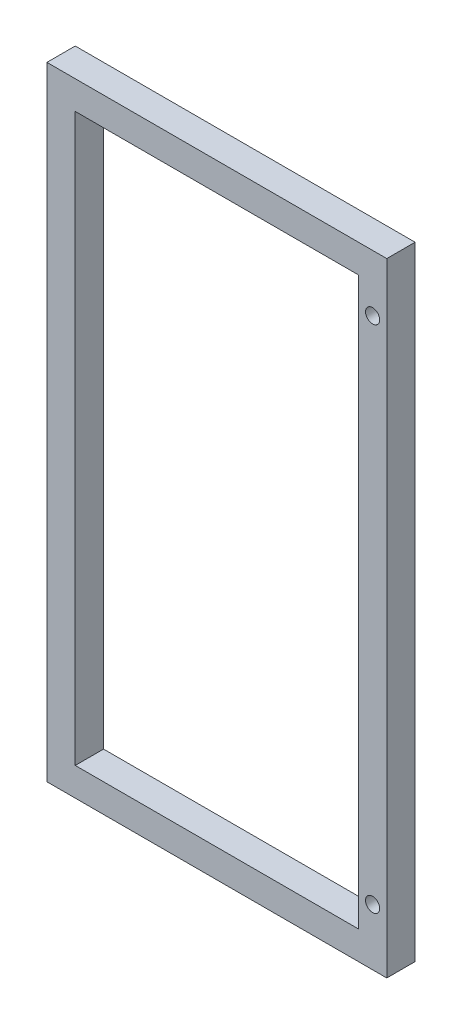
ISO-10303-21;
HEADER;
FILE_DESCRIPTION(('STEP AP214'),'2;1');
FILE_NAME('part.step','',(''),(''),'','','');
FILE_SCHEMA(('AUTOMOTIVE_DESIGN { 1 0 10303 214 1 1 1 1 }'));
ENDSEC;
DATA;
#1=APPLICATION_CONTEXT('core data for automotive mechanical design processes');
#2=APPLICATION_PROTOCOL_DEFINITION('international standard','automotive_design',2000,#1);
#3=PRODUCT_CONTEXT('',#1,'mechanical');
#4=PRODUCT('Part','Part','',(#3));
#5=PRODUCT_RELATED_PRODUCT_CATEGORY('part','',(#4));
#6=PRODUCT_DEFINITION_FORMATION('','',#4);
#7=PRODUCT_DEFINITION_CONTEXT('part definition',#1,'design');
#8=PRODUCT_DEFINITION('design','',#6,#7);
#9=PRODUCT_DEFINITION_SHAPE('','',#8);
#10=(LENGTH_UNIT() NAMED_UNIT(*) SI_UNIT(.MILLI.,.METRE.));
#11=(NAMED_UNIT(*) PLANE_ANGLE_UNIT() SI_UNIT($,.RADIAN.));
#12=(NAMED_UNIT(*) SI_UNIT($,.STERADIAN.) SOLID_ANGLE_UNIT());
#13=UNCERTAINTY_MEASURE_WITH_UNIT(LENGTH_MEASURE(1.E-05),#10,'distance_accuracy_value','');
#14=(GEOMETRIC_REPRESENTATION_CONTEXT(3) GLOBAL_UNCERTAINTY_ASSIGNED_CONTEXT((#13)) GLOBAL_UNIT_ASSIGNED_CONTEXT((#10,
#11,#12)) REPRESENTATION_CONTEXT('',''));
#15=CARTESIAN_POINT('',(0.,0.,0.));
#16=DIRECTION('',(0.,0.,1.));
#17=DIRECTION('',(1.,0.,0.));
#18=AXIS2_PLACEMENT_3D('',#15,#16,#17);
#19=CARTESIAN_POINT('',(-100.,-100.,100.));
#20=DIRECTION('',(-1.,0.,0.));
#21=DIRECTION('',(0.,0.,1.));
#22=AXIS2_PLACEMENT_3D('',#19,#20,#21);
#23=PLANE('',#22);
#24=DIRECTION('',(0.,1.,0.));
#25=VECTOR('',#24,1.);
#26=CARTESIAN_POINT('',(-100.,-100.,0.));
#27=LINE('',#26,#25);
#28=CARTESIAN_POINT('',(-100.,-100.,0.));
#29=VERTEX_POINT('',#28);
#30=CARTESIAN_POINT('',(-100.,2100.,0.));
#31=VERTEX_POINT('',#30);
#32=EDGE_CURVE('E157',#29,#31,#27,.T.);
#33=ORIENTED_EDGE('',*,*,#32,.F.);
#34=DIRECTION('',(0.,0.,-1.));
#35=VECTOR('',#34,1.);
#36=CARTESIAN_POINT('',(-100.,-100.,100.));
#37=LINE('',#36,#35);
#38=CARTESIAN_POINT('',(-100.,-100.,100.));
#39=VERTEX_POINT('',#38);
#40=EDGE_CURVE('E12',#39,#29,#37,.T.);
#41=ORIENTED_EDGE('',*,*,#40,.F.);
#42=DIRECTION('',(0.,1.,0.));
#43=VECTOR('',#42,1.);
#44=CARTESIAN_POINT('',(-100.,-100.,100.));
#45=LINE('',#44,#43);
#46=CARTESIAN_POINT('',(-100.,2100.,100.));
#47=VERTEX_POINT('',#46);
#48=EDGE_CURVE('E161',#39,#47,#45,.T.);
#49=ORIENTED_EDGE('',*,*,#48,.T.);
#50=DIRECTION('',(0.,0.,-1.));
#51=VECTOR('',#50,1.);
#52=CARTESIAN_POINT('',(-100.,2100.,100.));
#53=LINE('',#52,#51);
#54=EDGE_CURVE('E60',#47,#31,#53,.T.);
#55=ORIENTED_EDGE('',*,*,#54,.T.);
#56=EDGE_LOOP('',(#33,#41,#49,#55));
#57=FACE_BOUND('',#56,.T.);
#58=ADVANCED_FACE('F57',(#57),#23,.T.);
#59=CARTESIAN_POINT('',(-100.,-100.,100.));
#60=DIRECTION('',(0.,1.,0.));
#61=DIRECTION('',(0.,0.,1.));
#62=AXIS2_PLACEMENT_3D('',#59,#60,#61);
#63=PLANE('',#62);
#64=DIRECTION('',(1.,0.,0.));
#65=VECTOR('',#64,1.);
#66=CARTESIAN_POINT('',(-100.,-100.,0.));
#67=LINE('',#66,#65);
#68=CARTESIAN_POINT('',(1100.,-100.,0.));
#69=VERTEX_POINT('',#68);
#70=EDGE_CURVE('E165',#29,#69,#67,.T.);
#71=ORIENTED_EDGE('',*,*,#70,.T.);
#72=DIRECTION('',(0.,0.,-1.));
#73=VECTOR('',#72,1.);
#74=CARTESIAN_POINT('',(1100.,-100.,100.));
#75=LINE('',#74,#73);
#76=CARTESIAN_POINT('',(1100.,-100.,100.));
#77=VERTEX_POINT('',#76);
#78=EDGE_CURVE('E65',#77,#69,#75,.T.);
#79=ORIENTED_EDGE('',*,*,#78,.F.);
#80=DIRECTION('',(1.,0.,0.));
#81=VECTOR('',#80,1.);
#82=CARTESIAN_POINT('',(-100.,-100.,100.));
#83=LINE('',#82,#81);
#84=EDGE_CURVE('E170',#39,#77,#83,.T.);
#85=ORIENTED_EDGE('',*,*,#84,.F.);
#86=ORIENTED_EDGE('',*,*,#40,.T.);
#87=EDGE_LOOP('',(#71,#79,#85,#86));
#88=FACE_BOUND('',#87,.T.);
#89=ADVANCED_FACE('F197',(#88),#63,.F.);
#90=CARTESIAN_POINT('',(1100.,-100.,100.));
#91=DIRECTION('',(-1.,0.,0.));
#92=DIRECTION('',(0.,0.,1.));
#93=AXIS2_PLACEMENT_3D('',#90,#91,#92);
#94=PLANE('',#93);
#95=DIRECTION('',(0.,1.,0.));
#96=VECTOR('',#95,1.);
#97=CARTESIAN_POINT('',(1100.,-100.,0.));
#98=LINE('',#97,#96);
#99=CARTESIAN_POINT('',(1100.,2100.,0.));
#100=VERTEX_POINT('',#99);
#101=EDGE_CURVE('E177',#69,#100,#98,.T.);
#102=ORIENTED_EDGE('',*,*,#101,.T.);
#103=DIRECTION('',(0.,0.,-1.));
#104=VECTOR('',#103,1.);
#105=CARTESIAN_POINT('',(1100.,2100.,100.));
#106=LINE('',#105,#104);
#107=CARTESIAN_POINT('',(1100.,2100.,100.));
#108=VERTEX_POINT('',#107);
#109=EDGE_CURVE('E182',#108,#100,#106,.T.);
#110=ORIENTED_EDGE('',*,*,#109,.F.);
#111=DIRECTION('',(0.,1.,0.));
#112=VECTOR('',#111,1.);
#113=CARTESIAN_POINT('',(1100.,-100.,100.));
#114=LINE('',#113,#112);
#115=EDGE_CURVE('E168',#77,#108,#114,.T.);
#116=ORIENTED_EDGE('',*,*,#115,.F.);
#117=ORIENTED_EDGE('',*,*,#78,.T.);
#118=EDGE_LOOP('',(#102,#110,#116,#117));
#119=FACE_BOUND('',#118,.T.);
#120=ADVANCED_FACE('F201',(#119),#94,.F.);
#121=CARTESIAN_POINT('',(-100.,2100.,100.));
#122=DIRECTION('',(0.,1.,0.));
#123=DIRECTION('',(0.,0.,1.));
#124=AXIS2_PLACEMENT_3D('',#121,#122,#123);
#125=PLANE('',#124);
#126=DIRECTION('',(1.,0.,0.));
#127=VECTOR('',#126,1.);
#128=CARTESIAN_POINT('',(-100.,2100.,0.));
#129=LINE('',#128,#127);
#130=EDGE_CURVE('E174',#31,#100,#129,.T.);
#131=ORIENTED_EDGE('',*,*,#130,.F.);
#132=ORIENTED_EDGE('',*,*,#54,.F.);
#133=DIRECTION('',(1.,0.,0.));
#134=VECTOR('',#133,1.);
#135=CARTESIAN_POINT('',(-100.,2100.,100.));
#136=LINE('',#135,#134);
#137=EDGE_CURVE('E164',#47,#108,#136,.T.);
#138=ORIENTED_EDGE('',*,*,#137,.T.);
#139=ORIENTED_EDGE('',*,*,#109,.T.);
#140=EDGE_LOOP('',(#131,#132,#138,#139));
#141=FACE_BOUND('',#140,.T.);
#142=ADVANCED_FACE('F190',(#141),#125,.T.);
#143=CARTESIAN_POINT('',(0.,0.,100.));
#144=DIRECTION('',(0.,0.,-1.));
#145=DIRECTION('',(-1.,0.,0.));
#146=AXIS2_PLACEMENT_3D('',#143,#144,#145);
#147=PLANE('',#146);
#148=CARTESIAN_POINT('',(1050.,100.,100.));
#149=DIRECTION('',(0.,0.,1.));
#150=DIRECTION('',(1.,0.,0.));
#151=AXIS2_PLACEMENT_3D('',#148,#149,#150);
#152=CIRCLE('',#151,25.);
#153=CARTESIAN_POINT('',(1075.,100.,100.));
#154=VERTEX_POINT('',#153);
#155=EDGE_CURVE('E303',#154,#154,#152,.T.);
#156=ORIENTED_EDGE('',*,*,#155,.F.);
#157=EDGE_LOOP('',(#156));
#158=FACE_BOUND('',#157,.T.);
#159=CARTESIAN_POINT('',(1050.,1900.,100.));
#160=DIRECTION('',(0.,0.,1.));
#161=DIRECTION('',(1.,0.,0.));
#162=AXIS2_PLACEMENT_3D('',#159,#160,#161);
#163=CIRCLE('',#162,25.);
#164=CARTESIAN_POINT('',(1075.,1900.,100.));
#165=VERTEX_POINT('',#164);
#166=EDGE_CURVE('E144',#165,#165,#163,.T.);
#167=ORIENTED_EDGE('',*,*,#166,.F.);
#168=EDGE_LOOP('',(#167));
#169=FACE_BOUND('',#168,.T.);
#170=DIRECTION('',(1.,0.,0.));
#171=VECTOR('',#170,1.);
#172=CARTESIAN_POINT('',(0.,0.,100.));
#173=LINE('',#172,#171);
#174=CARTESIAN_POINT('',(0.,0.,100.));
#175=VERTEX_POINT('',#174);
#176=CARTESIAN_POINT('',(1000.,0.,100.));
#177=VERTEX_POINT('',#176);
#178=EDGE_CURVE('E127',#175,#177,#173,.T.);
#179=ORIENTED_EDGE('',*,*,#178,.F.);
#180=DIRECTION('',(0.,1.,0.));
#181=VECTOR('',#180,1.);
#182=CARTESIAN_POINT('',(0.,0.,100.));
#183=LINE('',#182,#181);
#184=CARTESIAN_POINT('',(-5.55111512312578E-13,2000.,100.));
#185=VERTEX_POINT('',#184);
#186=EDGE_CURVE('E124',#175,#185,#183,.T.);
#187=ORIENTED_EDGE('',*,*,#186,.T.);
#188=DIRECTION('',(1.,0.,0.));
#189=VECTOR('',#188,1.);
#190=CARTESIAN_POINT('',(-5.55111512312578E-13,2000.,100.));
#191=LINE('',#190,#189);
#192=CARTESIAN_POINT('',(999.999999999999,2000.,100.));
#193=VERTEX_POINT('',#192);
#194=EDGE_CURVE('E130',#185,#193,#191,.T.);
#195=ORIENTED_EDGE('',*,*,#194,.T.);
#196=DIRECTION('',(0.,1.,0.));
#197=VECTOR('',#196,1.);
#198=CARTESIAN_POINT('',(1000.,0.,100.));
#199=LINE('',#198,#197);
#200=EDGE_CURVE('E134',#177,#193,#199,.T.);
#201=ORIENTED_EDGE('',*,*,#200,.F.);
#202=EDGE_LOOP('',(#179,#187,#195,#201));
#203=FACE_BOUND('',#202,.T.);
#204=ORIENTED_EDGE('',*,*,#48,.F.);
#205=ORIENTED_EDGE('',*,*,#84,.T.);
#206=ORIENTED_EDGE('',*,*,#115,.T.);
#207=ORIENTED_EDGE('',*,*,#137,.F.);
#208=EDGE_LOOP('',(#204,#205,#206,#207));
#209=FACE_BOUND('',#208,.T.);
#210=ADVANCED_FACE('F136',(#158,#169,#203,#209),#147,.F.);
#211=CARTESIAN_POINT('',(0.,0.,0.));
#212=DIRECTION('',(0.,0.,-1.));
#213=DIRECTION('',(-1.,0.,0.));
#214=AXIS2_PLACEMENT_3D('',#211,#212,#213);
#215=PLANE('',#214);
#216=CARTESIAN_POINT('',(1050.,100.,0.));
#217=DIRECTION('',(0.,0.,1.));
#218=DIRECTION('',(1.,0.,0.));
#219=AXIS2_PLACEMENT_3D('',#216,#217,#218);
#220=CIRCLE('',#219,25.);
#221=CARTESIAN_POINT('',(1075.,100.,0.));
#222=VERTEX_POINT('',#221);
#223=EDGE_CURVE('E301',#222,#222,#220,.T.);
#224=ORIENTED_EDGE('',*,*,#223,.T.);
#225=EDGE_LOOP('',(#224));
#226=FACE_BOUND('',#225,.T.);
#227=CARTESIAN_POINT('',(1050.,1900.,0.));
#228=DIRECTION('',(0.,0.,1.));
#229=DIRECTION('',(1.,0.,0.));
#230=AXIS2_PLACEMENT_3D('',#227,#228,#229);
#231=CIRCLE('',#230,25.);
#232=CARTESIAN_POINT('',(1075.,1900.,0.));
#233=VERTEX_POINT('',#232);
#234=EDGE_CURVE('E151',#233,#233,#231,.T.);
#235=ORIENTED_EDGE('',*,*,#234,.T.);
#236=EDGE_LOOP('',(#235));
#237=FACE_BOUND('',#236,.T.);
#238=DIRECTION('',(0.,1.,0.));
#239=VECTOR('',#238,1.);
#240=CARTESIAN_POINT('',(0.,0.,0.));
#241=LINE('',#240,#239);
#242=CARTESIAN_POINT('',(0.,0.,0.));
#243=VERTEX_POINT('',#242);
#244=CARTESIAN_POINT('',(-5.55111512312578E-13,2000.,0.));
#245=VERTEX_POINT('',#244);
#246=EDGE_CURVE('E81',#243,#245,#241,.T.);
#247=ORIENTED_EDGE('',*,*,#246,.F.);
#248=DIRECTION('',(1.,0.,0.));
#249=VECTOR('',#248,1.);
#250=CARTESIAN_POINT('',(0.,0.,0.));
#251=LINE('',#250,#249);
#252=CARTESIAN_POINT('',(1000.,0.,0.));
#253=VERTEX_POINT('',#252);
#254=EDGE_CURVE('E138',#243,#253,#251,.T.);
#255=ORIENTED_EDGE('',*,*,#254,.T.);
#256=DIRECTION('',(0.,1.,0.));
#257=VECTOR('',#256,1.);
#258=CARTESIAN_POINT('',(1000.,0.,0.));
#259=LINE('',#258,#257);
#260=CARTESIAN_POINT('',(999.999999999999,2000.,0.));
#261=VERTEX_POINT('',#260);
#262=EDGE_CURVE('E141',#253,#261,#259,.T.);
#263=ORIENTED_EDGE('',*,*,#262,.T.);
#264=DIRECTION('',(1.,0.,0.));
#265=VECTOR('',#264,1.);
#266=CARTESIAN_POINT('',(-5.55111512312578E-13,2000.,0.));
#267=LINE('',#266,#265);
#268=EDGE_CURVE('E150',#245,#261,#267,.T.);
#269=ORIENTED_EDGE('',*,*,#268,.F.);
#270=EDGE_LOOP('',(#247,#255,#263,#269));
#271=FACE_BOUND('',#270,.T.);
#272=ORIENTED_EDGE('',*,*,#32,.T.);
#273=ORIENTED_EDGE('',*,*,#130,.T.);
#274=ORIENTED_EDGE('',*,*,#101,.F.);
#275=ORIENTED_EDGE('',*,*,#70,.F.);
#276=EDGE_LOOP('',(#272,#273,#274,#275));
#277=FACE_BOUND('',#276,.T.);
#278=ADVANCED_FACE('F194',(#226,#237,#271,#277),#215,.T.);
#279=CARTESIAN_POINT('',(0.,0.,100.));
#280=DIRECTION('',(-1.,0.,0.));
#281=DIRECTION('',(0.,-1.,0.));
#282=AXIS2_PLACEMENT_3D('',#279,#280,#281);
#283=PLANE('',#282);
#284=ORIENTED_EDGE('',*,*,#246,.T.);
#285=DIRECTION('',(0.,0.,-1.));
#286=VECTOR('',#285,1.);
#287=CARTESIAN_POINT('',(-5.55111512312578E-13,2000.,100.));
#288=LINE('',#287,#286);
#289=EDGE_CURVE('E121',#185,#245,#288,.T.);
#290=ORIENTED_EDGE('',*,*,#289,.F.);
#291=ORIENTED_EDGE('',*,*,#186,.F.);
#292=DIRECTION('',(0.,0.,-1.));
#293=VECTOR('',#292,1.);
#294=CARTESIAN_POINT('',(0.,0.,100.));
#295=LINE('',#294,#293);
#296=EDGE_CURVE('E155',#175,#243,#295,.T.);
#297=ORIENTED_EDGE('',*,*,#296,.T.);
#298=EDGE_LOOP('',(#284,#290,#291,#297));
#299=FACE_BOUND('',#298,.T.);
#300=ADVANCED_FACE('F122',(#299),#283,.F.);
#301=CARTESIAN_POINT('',(0.,0.,100.));
#302=DIRECTION('',(0.,1.,0.));
#303=DIRECTION('',(0.,0.,1.));
#304=AXIS2_PLACEMENT_3D('',#301,#302,#303);
#305=PLANE('',#304);
#306=ORIENTED_EDGE('',*,*,#254,.F.);
#307=ORIENTED_EDGE('',*,*,#296,.F.);
#308=ORIENTED_EDGE('',*,*,#178,.T.);
#309=DIRECTION('',(0.,0.,-1.));
#310=VECTOR('',#309,1.);
#311=CARTESIAN_POINT('',(1000.,0.,100.));
#312=LINE('',#311,#310);
#313=EDGE_CURVE('E158',#177,#253,#312,.T.);
#314=ORIENTED_EDGE('',*,*,#313,.T.);
#315=EDGE_LOOP('',(#306,#307,#308,#314));
#316=FACE_BOUND('',#315,.T.);
#317=ADVANCED_FACE('F239',(#316),#305,.T.);
#318=CARTESIAN_POINT('',(1000.,0.,100.));
#319=DIRECTION('',(-1.,0.,0.));
#320=DIRECTION('',(0.,-1.,0.));
#321=AXIS2_PLACEMENT_3D('',#318,#319,#320);
#322=PLANE('',#321);
#323=ORIENTED_EDGE('',*,*,#262,.F.);
#324=ORIENTED_EDGE('',*,*,#313,.F.);
#325=ORIENTED_EDGE('',*,*,#200,.T.);
#326=DIRECTION('',(0.,0.,-1.));
#327=VECTOR('',#326,1.);
#328=CARTESIAN_POINT('',(999.999999999999,2000.,100.));
#329=LINE('',#328,#327);
#330=EDGE_CURVE('E73',#193,#261,#329,.T.);
#331=ORIENTED_EDGE('',*,*,#330,.T.);
#332=EDGE_LOOP('',(#323,#324,#325,#331));
#333=FACE_BOUND('',#332,.T.);
#334=ADVANCED_FACE('F248',(#333),#322,.T.);
#335=CARTESIAN_POINT('',(-5.55111512312578E-13,2000.,100.));
#336=DIRECTION('',(0.,1.,0.));
#337=DIRECTION('',(0.,0.,1.));
#338=AXIS2_PLACEMENT_3D('',#335,#336,#337);
#339=PLANE('',#338);
#340=ORIENTED_EDGE('',*,*,#268,.T.);
#341=ORIENTED_EDGE('',*,*,#330,.F.);
#342=ORIENTED_EDGE('',*,*,#194,.F.);
#343=ORIENTED_EDGE('',*,*,#289,.T.);
#344=EDGE_LOOP('',(#340,#341,#342,#343));
#345=FACE_BOUND('',#344,.T.);
#346=ADVANCED_FACE('F131',(#345),#339,.F.);
#347=CARTESIAN_POINT('',(1050.,1900.,0.));
#348=DIRECTION('',(0.,0.,1.));
#349=DIRECTION('',(1.,0.,0.));
#350=AXIS2_PLACEMENT_3D('',#347,#348,#349);
#351=CYLINDRICAL_SURFACE('',#350,25.);
#352=ORIENTED_EDGE('',*,*,#234,.F.);
#353=EDGE_LOOP('',(#352));
#354=FACE_BOUND('',#353,.T.);
#355=ORIENTED_EDGE('',*,*,#166,.T.);
#356=EDGE_LOOP('',(#355));
#357=FACE_BOUND('',#356,.T.);
#358=ADVANCED_FACE('F266',(#354,#357),#351,.F.);
#359=CARTESIAN_POINT('',(1050.,100.,0.));
#360=DIRECTION('',(0.,0.,1.));
#361=DIRECTION('',(1.,0.,0.));
#362=AXIS2_PLACEMENT_3D('',#359,#360,#361);
#363=CYLINDRICAL_SURFACE('',#362,25.);
#364=ORIENTED_EDGE('',*,*,#223,.F.);
#365=EDGE_LOOP('',(#364));
#366=FACE_BOUND('',#365,.T.);
#367=ORIENTED_EDGE('',*,*,#155,.T.);
#368=EDGE_LOOP('',(#367));
#369=FACE_BOUND('',#368,.T.);
#370=ADVANCED_FACE('F284',(#366,#369),#363,.F.);
#371=CLOSED_SHELL('',(#58,#89,#120,#142,#210,#278,#300,#317,#334,#346,#358,#370));
#372=MANIFOLD_SOLID_BREP('B2',#371);
#373=ADVANCED_BREP_SHAPE_REPRESENTATION('',(#18,#372),#14);
#374=SHAPE_DEFINITION_REPRESENTATION(#9,#373);
ENDSEC;
END-ISO-10303-21;
